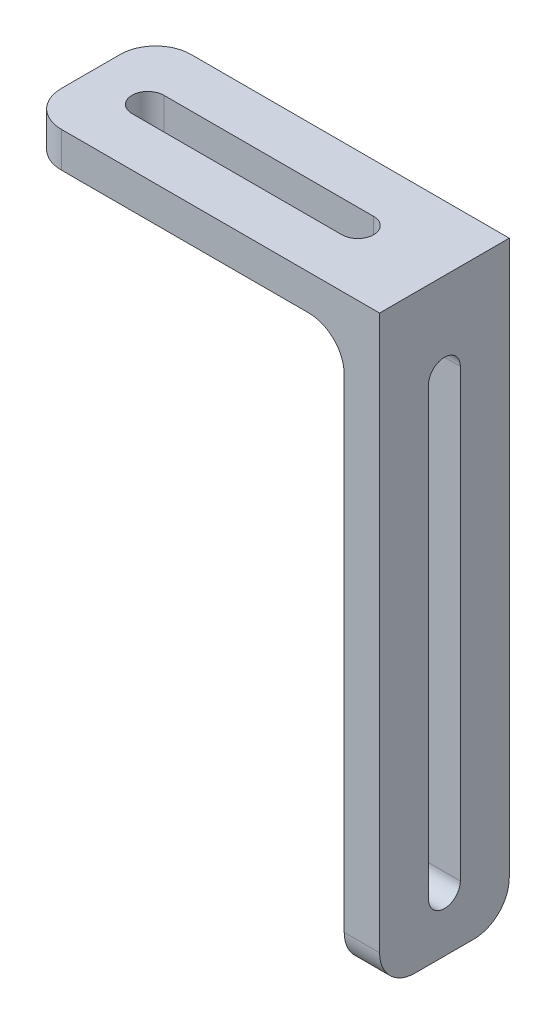
ISO-10303-21;
HEADER;
FILE_DESCRIPTION(('STEP AP214'),'2;1');
FILE_NAME('part.step','',(''),(''),'','','');
FILE_SCHEMA(('AUTOMOTIVE_DESIGN { 1 0 10303 214 1 1 1 1 }'));
ENDSEC;
DATA;
#1=APPLICATION_CONTEXT('core data for automotive mechanical design processes');
#2=APPLICATION_PROTOCOL_DEFINITION('international standard','automotive_design',2000,#1);
#3=PRODUCT_CONTEXT('',#1,'mechanical');
#4=PRODUCT('Part','Part','',(#3));
#5=PRODUCT_RELATED_PRODUCT_CATEGORY('part','',(#4));
#6=PRODUCT_DEFINITION_FORMATION('','',#4);
#7=PRODUCT_DEFINITION_CONTEXT('part definition',#1,'design');
#8=PRODUCT_DEFINITION('design','',#6,#7);
#9=PRODUCT_DEFINITION_SHAPE('','',#8);
#10=(LENGTH_UNIT() NAMED_UNIT(*) SI_UNIT(.MILLI.,.METRE.));
#11=(NAMED_UNIT(*) PLANE_ANGLE_UNIT() SI_UNIT($,.RADIAN.));
#12=(NAMED_UNIT(*) SI_UNIT($,.STERADIAN.) SOLID_ANGLE_UNIT());
#13=UNCERTAINTY_MEASURE_WITH_UNIT(LENGTH_MEASURE(1.E-05),#10,'distance_accuracy_value','');
#14=(GEOMETRIC_REPRESENTATION_CONTEXT(3) GLOBAL_UNCERTAINTY_ASSIGNED_CONTEXT((#13)) GLOBAL_UNIT_ASSIGNED_CONTEXT((#10,
#11,#12)) REPRESENTATION_CONTEXT('',''));
#15=CARTESIAN_POINT('',(0.,0.,0.));
#16=DIRECTION('',(0.,0.,1.));
#17=DIRECTION('',(1.,0.,0.));
#18=AXIS2_PLACEMENT_3D('',#15,#16,#17);
#19=CARTESIAN_POINT('',(0.,47.,11.));
#20=DIRECTION('',(1.,0.,0.));
#21=DIRECTION('',(0.,0.,-1.));
#22=AXIS2_PLACEMENT_3D('',#19,#20,#21);
#23=PLANE('',#22);
#24=DIRECTION('',(0.,-1.,0.));
#25=VECTOR('',#24,1.);
#26=CARTESIAN_POINT('',(0.,47.,0.));
#27=LINE('',#26,#25);
#28=CARTESIAN_POINT('',(0.,44.,0.));
#29=VERTEX_POINT('',#28);
#30=CARTESIAN_POINT('',(0.,3.,0.));
#31=VERTEX_POINT('',#30);
#32=EDGE_CURVE('E243',#29,#31,#27,.T.);
#33=ORIENTED_EDGE('',*,*,#32,.T.);
#34=CARTESIAN_POINT('',(0.,3.,3.));
#35=DIRECTION('',(1.,0.,0.));
#36=DIRECTION('',(0.,0.,-1.));
#37=AXIS2_PLACEMENT_3D('',#34,#35,#36);
#38=CIRCLE('',#37,3.);
#39=CARTESIAN_POINT('',(0.,0.,3.));
#40=VERTEX_POINT('',#39);
#41=EDGE_CURVE('E316',#31,#40,#38,.F.);
#42=ORIENTED_EDGE('',*,*,#41,.T.);
#43=DIRECTION('',(0.,0.,-1.));
#44=VECTOR('',#43,1.);
#45=CARTESIAN_POINT('',(0.,0.,11.));
#46=LINE('',#45,#44);
#47=CARTESIAN_POINT('',(0.,0.,8.));
#48=VERTEX_POINT('',#47);
#49=EDGE_CURVE('E273',#48,#40,#46,.T.);
#50=ORIENTED_EDGE('',*,*,#49,.F.);
#51=CARTESIAN_POINT('',(0.,3.,8.));
#52=DIRECTION('',(1.,0.,0.));
#53=DIRECTION('',(0.,0.,-1.));
#54=AXIS2_PLACEMENT_3D('',#51,#52,#53);
#55=CIRCLE('',#54,3.);
#56=CARTESIAN_POINT('',(0.,3.,11.));
#57=VERTEX_POINT('',#56);
#58=EDGE_CURVE('E314',#48,#57,#55,.F.);
#59=ORIENTED_EDGE('',*,*,#58,.T.);
#60=DIRECTION('',(0.,-1.,0.));
#61=VECTOR('',#60,1.);
#62=CARTESIAN_POINT('',(0.,47.,11.));
#63=LINE('',#62,#61);
#64=CARTESIAN_POINT('',(0.,44.,11.));
#65=VERTEX_POINT('',#64);
#66=EDGE_CURVE('E244',#65,#57,#63,.T.);
#67=ORIENTED_EDGE('',*,*,#66,.F.);
#68=DIRECTION('',(0.,0.,-1.));
#69=VECTOR('',#68,1.);
#70=CARTESIAN_POINT('',(0.,44.,0.));
#71=LINE('',#70,#69);
#72=CARTESIAN_POINT('',(0.,44.,5.5));
#73=VERTEX_POINT('',#72);
#74=EDGE_CURVE('E288',#65,#73,#71,.T.);
#75=ORIENTED_EDGE('',*,*,#74,.T.);
#76=CARTESIAN_POINT('',(0.,42.65,5.5));
#77=DIRECTION('',(1.,0.,0.));
#78=DIRECTION('',(0.,0.,-1.));
#79=AXIS2_PLACEMENT_3D('',#76,#77,#78);
#80=CIRCLE('',#79,1.35);
#81=CARTESIAN_POINT('',(0.,42.65,6.85));
#82=VERTEX_POINT('',#81);
#83=EDGE_CURVE('E239',#73,#82,#80,.T.);
#84=ORIENTED_EDGE('',*,*,#83,.T.);
#85=DIRECTION('',(0.,-1.,0.));
#86=VECTOR('',#85,1.);
#87=CARTESIAN_POINT('',(0.,47.,6.85));
#88=LINE('',#87,#86);
#89=CARTESIAN_POINT('',(0.,4.85,6.84999999999999));
#90=VERTEX_POINT('',#89);
#91=EDGE_CURVE('E224',#82,#90,#88,.T.);
#92=ORIENTED_EDGE('',*,*,#91,.T.);
#93=CARTESIAN_POINT('',(0.,4.85,5.49999999999999));
#94=DIRECTION('',(1.,0.,0.));
#95=DIRECTION('',(0.,0.,-1.));
#96=AXIS2_PLACEMENT_3D('',#93,#94,#95);
#97=CIRCLE('',#96,1.35);
#98=CARTESIAN_POINT('',(0.,4.85,4.15));
#99=VERTEX_POINT('',#98);
#100=EDGE_CURVE('E233',#90,#99,#97,.T.);
#101=ORIENTED_EDGE('',*,*,#100,.T.);
#102=DIRECTION('',(0.,1.,0.));
#103=VECTOR('',#102,1.);
#104=CARTESIAN_POINT('',(0.,47.,4.15));
#105=LINE('',#104,#103);
#106=CARTESIAN_POINT('',(0.,42.65,4.15));
#107=VERTEX_POINT('',#106);
#108=EDGE_CURVE('E236',#99,#107,#105,.T.);
#109=ORIENTED_EDGE('',*,*,#108,.T.);
#110=EDGE_CURVE('E240',#107,#73,#80,.T.);
#111=ORIENTED_EDGE('',*,*,#110,.T.);
#112=DIRECTION('',(0.,0.,-1.));
#113=VECTOR('',#112,1.);
#114=CARTESIAN_POINT('',(0.,44.,0.));
#115=LINE('',#114,#113);
#116=EDGE_CURVE('E286',#73,#29,#115,.T.);
#117=ORIENTED_EDGE('',*,*,#116,.T.);
#118=EDGE_LOOP('',(#33,#42,#50,#59,#67,#75,#84,#92,#101,#109,#111,#117));
#119=FACE_BOUND('',#118,.T.);
#120=ADVANCED_FACE('F38',(#119),#23,.F.);
#121=CARTESIAN_POINT('',(0.,0.,11.));
#122=DIRECTION('',(0.,1.,0.));
#123=DIRECTION('',(0.,0.,1.));
#124=AXIS2_PLACEMENT_3D('',#121,#122,#123);
#125=PLANE('',#124);
#126=ORIENTED_EDGE('',*,*,#49,.T.);
#127=DIRECTION('',(1.,0.,0.));
#128=VECTOR('',#127,1.);
#129=CARTESIAN_POINT('',(0.,0.,3.));
#130=LINE('',#129,#128);
#131=CARTESIAN_POINT('',(3.,0.,3.));
#132=VERTEX_POINT('',#131);
#133=EDGE_CURVE('E303',#40,#132,#130,.T.);
#134=ORIENTED_EDGE('',*,*,#133,.T.);
#135=DIRECTION('',(0.,0.,-1.));
#136=VECTOR('',#135,1.);
#137=CARTESIAN_POINT('',(3.,0.,11.));
#138=LINE('',#137,#136);
#139=CARTESIAN_POINT('',(3.,0.,8.));
#140=VERTEX_POINT('',#139);
#141=EDGE_CURVE('E270',#140,#132,#138,.T.);
#142=ORIENTED_EDGE('',*,*,#141,.F.);
#143=DIRECTION('',(1.,0.,0.));
#144=VECTOR('',#143,1.);
#145=CARTESIAN_POINT('',(0.,0.,8.));
#146=LINE('',#145,#144);
#147=EDGE_CURVE('E301',#140,#48,#146,.F.);
#148=ORIENTED_EDGE('',*,*,#147,.T.);
#149=EDGE_LOOP('',(#126,#134,#142,#148));
#150=FACE_BOUND('',#149,.T.);
#151=ADVANCED_FACE('F360',(#150),#125,.F.);
#152=CARTESIAN_POINT('',(3.,0.,11.));
#153=DIRECTION('',(-1.,0.,0.));
#154=DIRECTION('',(0.,0.,1.));
#155=AXIS2_PLACEMENT_3D('',#152,#153,#154);
#156=PLANE('',#155);
#157=DIRECTION('',(0.,-1.,0.));
#158=VECTOR('',#157,1.);
#159=CARTESIAN_POINT('',(3.,42.65,6.85));
#160=LINE('',#159,#158);
#161=CARTESIAN_POINT('',(3.,42.65,6.85));
#162=VERTEX_POINT('',#161);
#163=CARTESIAN_POINT('',(3.,4.85,6.84999999999999));
#164=VERTEX_POINT('',#163);
#165=EDGE_CURVE('E212',#162,#164,#160,.T.);
#166=ORIENTED_EDGE('',*,*,#165,.F.);
#167=CARTESIAN_POINT('',(3.,42.65,5.5));
#168=DIRECTION('',(1.,0.,0.));
#169=DIRECTION('',(0.,0.,-1.));
#170=AXIS2_PLACEMENT_3D('',#167,#168,#169);
#171=CIRCLE('',#170,1.35);
#172=CARTESIAN_POINT('',(3.,42.65,4.15));
#173=VERTEX_POINT('',#172);
#174=EDGE_CURVE('E208',#173,#162,#171,.T.);
#175=ORIENTED_EDGE('',*,*,#174,.F.);
#176=DIRECTION('',(0.,1.,0.));
#177=VECTOR('',#176,1.);
#178=CARTESIAN_POINT('',(3.,42.65,4.15));
#179=LINE('',#178,#177);
#180=CARTESIAN_POINT('',(3.,4.85,4.15));
#181=VERTEX_POINT('',#180);
#182=EDGE_CURVE('E218',#181,#173,#179,.T.);
#183=ORIENTED_EDGE('',*,*,#182,.F.);
#184=CARTESIAN_POINT('',(3.,4.85,5.49999999999999));
#185=DIRECTION('',(1.,0.,0.));
#186=DIRECTION('',(0.,0.,-1.));
#187=AXIS2_PLACEMENT_3D('',#184,#185,#186);
#188=CIRCLE('',#187,1.35);
#189=EDGE_CURVE('E215',#164,#181,#188,.T.);
#190=ORIENTED_EDGE('',*,*,#189,.F.);
#191=EDGE_LOOP('',(#166,#175,#183,#190));
#192=FACE_BOUND('',#191,.T.);
#193=ORIENTED_EDGE('',*,*,#141,.T.);
#194=CARTESIAN_POINT('',(3.,3.,3.));
#195=DIRECTION('',(-1.,0.,0.));
#196=DIRECTION('',(0.,0.,1.));
#197=AXIS2_PLACEMENT_3D('',#194,#195,#196);
#198=CIRCLE('',#197,3.);
#199=CARTESIAN_POINT('',(3.,3.,0.));
#200=VERTEX_POINT('',#199);
#201=EDGE_CURVE('E308',#132,#200,#198,.F.);
#202=ORIENTED_EDGE('',*,*,#201,.T.);
#203=DIRECTION('',(0.,1.,0.));
#204=VECTOR('',#203,1.);
#205=CARTESIAN_POINT('',(3.,0.,0.));
#206=LINE('',#205,#204);
#207=CARTESIAN_POINT('',(3.,50.,0.));
#208=VERTEX_POINT('',#207);
#209=EDGE_CURVE('E258',#200,#208,#206,.T.);
#210=ORIENTED_EDGE('',*,*,#209,.T.);
#211=DIRECTION('',(0.,0.,-1.));
#212=VECTOR('',#211,1.);
#213=CARTESIAN_POINT('',(3.,50.,11.));
#214=LINE('',#213,#212);
#215=CARTESIAN_POINT('',(3.,50.,11.));
#216=VERTEX_POINT('',#215);
#217=EDGE_CURVE('E267',#216,#208,#214,.T.);
#218=ORIENTED_EDGE('',*,*,#217,.F.);
#219=DIRECTION('',(0.,1.,0.));
#220=VECTOR('',#219,1.);
#221=CARTESIAN_POINT('',(3.,0.,11.));
#222=LINE('',#221,#220);
#223=CARTESIAN_POINT('',(3.,3.,11.));
#224=VERTEX_POINT('',#223);
#225=EDGE_CURVE('E247',#224,#216,#222,.T.);
#226=ORIENTED_EDGE('',*,*,#225,.F.);
#227=CARTESIAN_POINT('',(3.,3.,8.));
#228=DIRECTION('',(-1.,0.,0.));
#229=DIRECTION('',(0.,0.,1.));
#230=AXIS2_PLACEMENT_3D('',#227,#228,#229);
#231=CIRCLE('',#230,3.);
#232=EDGE_CURVE('E306',#224,#140,#231,.F.);
#233=ORIENTED_EDGE('',*,*,#232,.T.);
#234=EDGE_LOOP('',(#193,#202,#210,#218,#226,#233));
#235=FACE_BOUND('',#234,.T.);
#236=ADVANCED_FACE('F366',(#192,#235),#156,.F.);
#237=CARTESIAN_POINT('',(3.,50.,11.));
#238=DIRECTION('',(0.,-1.,0.));
#239=DIRECTION('',(0.,0.,-1.));
#240=AXIS2_PLACEMENT_3D('',#237,#238,#239);
#241=PLANE('',#240);
#242=DIRECTION('',(1.,0.,0.));
#243=VECTOR('',#242,1.);
#244=CARTESIAN_POINT('',(-22.15,50.,6.85));
#245=LINE('',#244,#243);
#246=CARTESIAN_POINT('',(-22.15,50.,6.85));
#247=VERTEX_POINT('',#246);
#248=CARTESIAN_POINT('',(-4.35,50.,6.85));
#249=VERTEX_POINT('',#248);
#250=EDGE_CURVE('E192',#247,#249,#245,.T.);
#251=ORIENTED_EDGE('',*,*,#250,.F.);
#252=CARTESIAN_POINT('',(-22.15,50.,5.5));
#253=DIRECTION('',(0.,1.,0.));
#254=DIRECTION('',(0.,0.,1.));
#255=AXIS2_PLACEMENT_3D('',#252,#253,#254);
#256=CIRCLE('',#255,1.35);
#257=CARTESIAN_POINT('',(-22.15,50.,4.15));
#258=VERTEX_POINT('',#257);
#259=EDGE_CURVE('E197',#258,#247,#256,.T.);
#260=ORIENTED_EDGE('',*,*,#259,.F.);
#261=DIRECTION('',(1.,0.,0.));
#262=VECTOR('',#261,1.);
#263=CARTESIAN_POINT('',(-22.15,50.,4.15));
#264=LINE('',#263,#262);
#265=CARTESIAN_POINT('',(-4.35,50.,4.15));
#266=VERTEX_POINT('',#265);
#267=EDGE_CURVE('E201',#258,#266,#264,.T.);
#268=ORIENTED_EDGE('',*,*,#267,.T.);
#269=CARTESIAN_POINT('',(-4.35,50.,5.5));
#270=DIRECTION('',(0.,1.,0.));
#271=DIRECTION('',(0.,0.,1.));
#272=AXIS2_PLACEMENT_3D('',#269,#270,#271);
#273=CIRCLE('',#272,1.35);
#274=EDGE_CURVE('E180',#249,#266,#273,.T.);
#275=ORIENTED_EDGE('',*,*,#274,.F.);
#276=EDGE_LOOP('',(#251,#260,#268,#275));
#277=FACE_BOUND('',#276,.T.);
#278=DIRECTION('',(0.,0.,-1.));
#279=VECTOR('',#278,1.);
#280=CARTESIAN_POINT('',(-27.,50.,11.));
#281=LINE('',#280,#279);
#282=CARTESIAN_POINT('',(-27.,50.,8.));
#283=VERTEX_POINT('',#282);
#284=CARTESIAN_POINT('',(-27.,50.,3.));
#285=VERTEX_POINT('',#284);
#286=EDGE_CURVE('E265',#283,#285,#281,.T.);
#287=ORIENTED_EDGE('',*,*,#286,.F.);
#288=CARTESIAN_POINT('',(-24.,50.,8.));
#289=DIRECTION('',(0.,-1.,0.));
#290=DIRECTION('',(0.,0.,-1.));
#291=AXIS2_PLACEMENT_3D('',#288,#289,#290);
#292=CIRCLE('',#291,3.);
#293=CARTESIAN_POINT('',(-24.,50.,11.));
#294=VERTEX_POINT('',#293);
#295=EDGE_CURVE('E11',#283,#294,#292,.F.);
#296=ORIENTED_EDGE('',*,*,#295,.T.);
#297=DIRECTION('',(-1.,0.,0.));
#298=VECTOR('',#297,1.);
#299=CARTESIAN_POINT('',(3.,50.,11.));
#300=LINE('',#299,#298);
#301=EDGE_CURVE('E250',#216,#294,#300,.T.);
#302=ORIENTED_EDGE('',*,*,#301,.F.);
#303=ORIENTED_EDGE('',*,*,#217,.T.);
#304=DIRECTION('',(-1.,0.,0.));
#305=VECTOR('',#304,1.);
#306=CARTESIAN_POINT('',(3.,50.,0.));
#307=LINE('',#306,#305);
#308=CARTESIAN_POINT('',(-24.,50.,0.));
#309=VERTEX_POINT('',#308);
#310=EDGE_CURVE('E260',#208,#309,#307,.T.);
#311=ORIENTED_EDGE('',*,*,#310,.T.);
#312=CARTESIAN_POINT('',(-24.,50.,3.));
#313=DIRECTION('',(0.,-1.,0.));
#314=DIRECTION('',(0.,0.,-1.));
#315=AXIS2_PLACEMENT_3D('',#312,#313,#314);
#316=CIRCLE('',#315,3.);
#317=EDGE_CURVE('E46',#309,#285,#316,.F.);
#318=ORIENTED_EDGE('',*,*,#317,.T.);
#319=EDGE_LOOP('',(#287,#296,#302,#303,#311,#318));
#320=FACE_BOUND('',#319,.T.);
#321=ADVANCED_FACE('F199',(#277,#320),#241,.F.);
#322=CARTESIAN_POINT('',(-27.,50.,11.));
#323=DIRECTION('',(1.,0.,0.));
#324=DIRECTION('',(0.,0.,-1.));
#325=AXIS2_PLACEMENT_3D('',#322,#323,#324);
#326=PLANE('',#325);
#327=DIRECTION('',(0.,0.,-1.));
#328=VECTOR('',#327,1.);
#329=CARTESIAN_POINT('',(-27.,47.,11.));
#330=LINE('',#329,#328);
#331=CARTESIAN_POINT('',(-27.,47.,8.));
#332=VERTEX_POINT('',#331);
#333=CARTESIAN_POINT('',(-27.,47.,3.));
#334=VERTEX_POINT('',#333);
#335=EDGE_CURVE('E255',#332,#334,#330,.T.);
#336=ORIENTED_EDGE('',*,*,#335,.F.);
#337=DIRECTION('',(0.,-1.,0.));
#338=VECTOR('',#337,1.);
#339=CARTESIAN_POINT('',(-27.,50.,8.));
#340=LINE('',#339,#338);
#341=EDGE_CURVE('E59',#332,#283,#340,.F.);
#342=ORIENTED_EDGE('',*,*,#341,.T.);
#343=ORIENTED_EDGE('',*,*,#286,.T.);
#344=DIRECTION('',(0.,-1.,0.));
#345=VECTOR('',#344,1.);
#346=CARTESIAN_POINT('',(-27.,50.,3.));
#347=LINE('',#346,#345);
#348=EDGE_CURVE('E328',#285,#334,#347,.T.);
#349=ORIENTED_EDGE('',*,*,#348,.T.);
#350=EDGE_LOOP('',(#336,#342,#343,#349));
#351=FACE_BOUND('',#350,.T.);
#352=ADVANCED_FACE('F332',(#351),#326,.F.);
#353=CARTESIAN_POINT('',(-27.,47.,11.));
#354=DIRECTION('',(0.,1.,0.));
#355=DIRECTION('',(0.,0.,1.));
#356=AXIS2_PLACEMENT_3D('',#353,#354,#355);
#357=PLANE('',#356);
#358=DIRECTION('',(1.,0.,0.));
#359=VECTOR('',#358,1.);
#360=CARTESIAN_POINT('',(-27.,47.,11.));
#361=LINE('',#360,#359);
#362=CARTESIAN_POINT('',(-24.,47.,11.));
#363=VERTEX_POINT('',#362);
#364=CARTESIAN_POINT('',(-3.,47.,11.));
#365=VERTEX_POINT('',#364);
#366=EDGE_CURVE('E253',#363,#365,#361,.T.);
#367=ORIENTED_EDGE('',*,*,#366,.F.);
#368=CARTESIAN_POINT('',(-24.,47.,8.));
#369=DIRECTION('',(0.,1.,0.));
#370=DIRECTION('',(0.,0.,1.));
#371=AXIS2_PLACEMENT_3D('',#368,#369,#370);
#372=CIRCLE('',#371,3.);
#373=EDGE_CURVE('E326',#363,#332,#372,.F.);
#374=ORIENTED_EDGE('',*,*,#373,.T.);
#375=ORIENTED_EDGE('',*,*,#335,.T.);
#376=CARTESIAN_POINT('',(-24.,47.,3.));
#377=DIRECTION('',(0.,1.,0.));
#378=DIRECTION('',(0.,0.,1.));
#379=AXIS2_PLACEMENT_3D('',#376,#377,#378);
#380=CIRCLE('',#379,3.);
#381=CARTESIAN_POINT('',(-24.,47.,0.));
#382=VERTEX_POINT('',#381);
#383=EDGE_CURVE('E324',#334,#382,#380,.F.);
#384=ORIENTED_EDGE('',*,*,#383,.T.);
#385=DIRECTION('',(1.,0.,0.));
#386=VECTOR('',#385,1.);
#387=CARTESIAN_POINT('',(-27.,47.,0.));
#388=LINE('',#387,#386);
#389=CARTESIAN_POINT('',(-3.,47.,0.));
#390=VERTEX_POINT('',#389);
#391=EDGE_CURVE('E248',#382,#390,#388,.T.);
#392=ORIENTED_EDGE('',*,*,#391,.T.);
#393=DIRECTION('',(0.,0.,-1.));
#394=VECTOR('',#393,1.);
#395=CARTESIAN_POINT('',(-3.,47.,11.));
#396=LINE('',#395,#394);
#397=CARTESIAN_POINT('',(-3.,47.,5.5));
#398=VERTEX_POINT('',#397);
#399=EDGE_CURVE('E294',#390,#398,#396,.F.);
#400=ORIENTED_EDGE('',*,*,#399,.T.);
#401=CARTESIAN_POINT('',(-4.35,47.,5.5));
#402=DIRECTION('',(0.,1.,0.));
#403=DIRECTION('',(0.,0.,1.));
#404=AXIS2_PLACEMENT_3D('',#401,#402,#403);
#405=CIRCLE('',#404,1.35);
#406=CARTESIAN_POINT('',(-4.35,47.,4.15));
#407=VERTEX_POINT('',#406);
#408=EDGE_CURVE('E278',#398,#407,#405,.T.);
#409=ORIENTED_EDGE('',*,*,#408,.T.);
#410=DIRECTION('',(1.,0.,0.));
#411=VECTOR('',#410,1.);
#412=CARTESIAN_POINT('',(-27.,47.,4.15));
#413=LINE('',#412,#411);
#414=CARTESIAN_POINT('',(-22.15,47.,4.15));
#415=VERTEX_POINT('',#414);
#416=EDGE_CURVE('E280',#415,#407,#413,.T.);
#417=ORIENTED_EDGE('',*,*,#416,.F.);
#418=CARTESIAN_POINT('',(-22.15,47.,5.5));
#419=DIRECTION('',(0.,1.,0.));
#420=DIRECTION('',(0.,0.,1.));
#421=AXIS2_PLACEMENT_3D('',#418,#419,#420);
#422=CIRCLE('',#421,1.35);
#423=CARTESIAN_POINT('',(-22.15,47.,6.85));
#424=VERTEX_POINT('',#423);
#425=EDGE_CURVE('E283',#415,#424,#422,.T.);
#426=ORIENTED_EDGE('',*,*,#425,.T.);
#427=DIRECTION('',(1.,0.,0.));
#428=VECTOR('',#427,1.);
#429=CARTESIAN_POINT('',(-27.,47.,6.85));
#430=LINE('',#429,#428);
#431=CARTESIAN_POINT('',(-4.35,47.,6.85));
#432=VERTEX_POINT('',#431);
#433=EDGE_CURVE('E276',#424,#432,#430,.T.);
#434=ORIENTED_EDGE('',*,*,#433,.T.);
#435=EDGE_CURVE('E184',#432,#398,#405,.T.);
#436=ORIENTED_EDGE('',*,*,#435,.T.);
#437=DIRECTION('',(0.,0.,-1.));
#438=VECTOR('',#437,1.);
#439=CARTESIAN_POINT('',(-3.,47.,11.));
#440=LINE('',#439,#438);
#441=EDGE_CURVE('E291',#398,#365,#440,.F.);
#442=ORIENTED_EDGE('',*,*,#441,.T.);
#443=EDGE_LOOP('',(#367,#374,#375,#384,#392,#400,#409,#417,#426,#434,#436,#442));
#444=FACE_BOUND('',#443,.T.);
#445=ADVANCED_FACE('F336',(#444),#357,.F.);
#446=CARTESIAN_POINT('',(0.,0.,11.));
#447=DIRECTION('',(0.,0.,1.));
#448=DIRECTION('',(1.,0.,0.));
#449=AXIS2_PLACEMENT_3D('',#446,#447,#448);
#450=PLANE('',#449);
#451=ORIENTED_EDGE('',*,*,#66,.T.);
#452=DIRECTION('',(1.,0.,0.));
#453=VECTOR('',#452,1.);
#454=CARTESIAN_POINT('',(3.,3.,11.));
#455=LINE('',#454,#453);
#456=EDGE_CURVE('E321',#57,#224,#455,.T.);
#457=ORIENTED_EDGE('',*,*,#456,.T.);
#458=ORIENTED_EDGE('',*,*,#225,.T.);
#459=ORIENTED_EDGE('',*,*,#301,.T.);
#460=DIRECTION('',(0.,-1.,0.));
#461=VECTOR('',#460,1.);
#462=CARTESIAN_POINT('',(-24.,47.,11.));
#463=LINE('',#462,#461);
#464=EDGE_CURVE('E318',#294,#363,#463,.T.);
#465=ORIENTED_EDGE('',*,*,#464,.T.);
#466=ORIENTED_EDGE('',*,*,#366,.T.);
#467=CARTESIAN_POINT('',(-3.,44.,11.));
#468=DIRECTION('',(0.,0.,1.));
#469=DIRECTION('',(1.,0.,0.));
#470=AXIS2_PLACEMENT_3D('',#467,#468,#469);
#471=CIRCLE('',#470,3.);
#472=EDGE_CURVE('E299',#365,#65,#471,.F.);
#473=ORIENTED_EDGE('',*,*,#472,.T.);
#474=EDGE_LOOP('',(#451,#457,#458,#459,#465,#466,#473));
#475=FACE_BOUND('',#474,.T.);
#476=ADVANCED_FACE('F343',(#475),#450,.T.);
#477=CARTESIAN_POINT('',(0.,0.,0.));
#478=DIRECTION('',(0.,0.,1.));
#479=DIRECTION('',(1.,0.,0.));
#480=AXIS2_PLACEMENT_3D('',#477,#478,#479);
#481=PLANE('',#480);
#482=ORIENTED_EDGE('',*,*,#209,.F.);
#483=DIRECTION('',(1.,0.,0.));
#484=VECTOR('',#483,1.);
#485=CARTESIAN_POINT('',(0.,3.,0.));
#486=LINE('',#485,#484);
#487=EDGE_CURVE('E312',#200,#31,#486,.F.);
#488=ORIENTED_EDGE('',*,*,#487,.T.);
#489=ORIENTED_EDGE('',*,*,#32,.F.);
#490=CARTESIAN_POINT('',(-3.,44.,0.));
#491=DIRECTION('',(0.,0.,1.));
#492=DIRECTION('',(1.,0.,0.));
#493=AXIS2_PLACEMENT_3D('',#490,#491,#492);
#494=CIRCLE('',#493,3.);
#495=EDGE_CURVE('E296',#29,#390,#494,.T.);
#496=ORIENTED_EDGE('',*,*,#495,.T.);
#497=ORIENTED_EDGE('',*,*,#391,.F.);
#498=DIRECTION('',(0.,-1.,0.));
#499=VECTOR('',#498,1.);
#500=CARTESIAN_POINT('',(-24.,0.,0.));
#501=LINE('',#500,#499);
#502=EDGE_CURVE('E310',#382,#309,#501,.F.);
#503=ORIENTED_EDGE('',*,*,#502,.T.);
#504=ORIENTED_EDGE('',*,*,#310,.F.);
#505=EDGE_LOOP('',(#482,#488,#489,#496,#497,#503,#504));
#506=FACE_BOUND('',#505,.T.);
#507=ADVANCED_FACE('F351',(#506),#481,.F.);
#508=CARTESIAN_POINT('',(-27.,42.65,5.5));
#509=DIRECTION('',(1.,0.,0.));
#510=DIRECTION('',(0.,0.,-1.));
#511=AXIS2_PLACEMENT_3D('',#508,#509,#510);
#512=CYLINDRICAL_SURFACE('',#511,1.35);
#513=DIRECTION('',(1.,0.,0.));
#514=VECTOR('',#513,1.);
#515=CARTESIAN_POINT('',(-27.,42.65,4.15));
#516=LINE('',#515,#514);
#517=EDGE_CURVE('E222',#107,#173,#516,.T.);
#518=ORIENTED_EDGE('',*,*,#517,.T.);
#519=ORIENTED_EDGE('',*,*,#174,.T.);
#520=DIRECTION('',(1.,0.,0.));
#521=VECTOR('',#520,1.);
#522=CARTESIAN_POINT('',(-27.,42.65,6.85));
#523=LINE('',#522,#521);
#524=EDGE_CURVE('E221',#82,#162,#523,.T.);
#525=ORIENTED_EDGE('',*,*,#524,.F.);
#526=ORIENTED_EDGE('',*,*,#83,.F.);
#527=ORIENTED_EDGE('',*,*,#110,.F.);
#528=EDGE_LOOP('',(#518,#519,#525,#526,#527));
#529=FACE_BOUND('',#528,.T.);
#530=ADVANCED_FACE('F397',(#529),#512,.F.);
#531=CARTESIAN_POINT('',(-27.,42.65,4.15));
#532=DIRECTION('',(0.,0.,-1.));
#533=DIRECTION('',(0.,1.,0.));
#534=AXIS2_PLACEMENT_3D('',#531,#532,#533);
#535=PLANE('',#534);
#536=DIRECTION('',(1.,0.,0.));
#537=VECTOR('',#536,1.);
#538=CARTESIAN_POINT('',(-27.,4.85,4.15));
#539=LINE('',#538,#537);
#540=EDGE_CURVE('E225',#99,#181,#539,.T.);
#541=ORIENTED_EDGE('',*,*,#540,.T.);
#542=ORIENTED_EDGE('',*,*,#182,.T.);
#543=ORIENTED_EDGE('',*,*,#517,.F.);
#544=ORIENTED_EDGE('',*,*,#108,.F.);
#545=EDGE_LOOP('',(#541,#542,#543,#544));
#546=FACE_BOUND('',#545,.T.);
#547=ADVANCED_FACE('F403',(#546),#535,.F.);
#548=CARTESIAN_POINT('',(-27.,4.85,5.49999999999999));
#549=DIRECTION('',(1.,0.,0.));
#550=DIRECTION('',(0.,0.,-1.));
#551=AXIS2_PLACEMENT_3D('',#548,#549,#550);
#552=CYLINDRICAL_SURFACE('',#551,1.35);
#553=DIRECTION('',(1.,0.,0.));
#554=VECTOR('',#553,1.);
#555=CARTESIAN_POINT('',(-27.,4.85,6.84999999999999));
#556=LINE('',#555,#554);
#557=EDGE_CURVE('E227',#90,#164,#556,.T.);
#558=ORIENTED_EDGE('',*,*,#557,.T.);
#559=ORIENTED_EDGE('',*,*,#189,.T.);
#560=ORIENTED_EDGE('',*,*,#540,.F.);
#561=ORIENTED_EDGE('',*,*,#100,.F.);
#562=EDGE_LOOP('',(#558,#559,#560,#561));
#563=FACE_BOUND('',#562,.T.);
#564=ADVANCED_FACE('F405',(#563),#552,.F.);
#565=CARTESIAN_POINT('',(-27.,42.65,6.85));
#566=DIRECTION('',(0.,0.,1.));
#567=DIRECTION('',(0.,-1.,0.));
#568=AXIS2_PLACEMENT_3D('',#565,#566,#567);
#569=PLANE('',#568);
#570=ORIENTED_EDGE('',*,*,#524,.T.);
#571=ORIENTED_EDGE('',*,*,#165,.T.);
#572=ORIENTED_EDGE('',*,*,#557,.F.);
#573=ORIENTED_EDGE('',*,*,#91,.F.);
#574=EDGE_LOOP('',(#570,#571,#572,#573));
#575=FACE_BOUND('',#574,.T.);
#576=ADVANCED_FACE('F412',(#575),#569,.F.);
#577=CARTESIAN_POINT('',(-22.15,0.,5.5));
#578=DIRECTION('',(0.,1.,0.));
#579=DIRECTION('',(0.,0.,1.));
#580=AXIS2_PLACEMENT_3D('',#577,#578,#579);
#581=CYLINDRICAL_SURFACE('',#580,1.35);
#582=DIRECTION('',(0.,1.,0.));
#583=VECTOR('',#582,1.);
#584=CARTESIAN_POINT('',(-22.15,0.,4.15));
#585=LINE('',#584,#583);
#586=EDGE_CURVE('E206',#415,#258,#585,.T.);
#587=ORIENTED_EDGE('',*,*,#586,.T.);
#588=ORIENTED_EDGE('',*,*,#259,.T.);
#589=DIRECTION('',(0.,1.,0.));
#590=VECTOR('',#589,1.);
#591=CARTESIAN_POINT('',(-22.15,0.,6.85));
#592=LINE('',#591,#590);
#593=EDGE_CURVE('E188',#424,#247,#592,.T.);
#594=ORIENTED_EDGE('',*,*,#593,.F.);
#595=ORIENTED_EDGE('',*,*,#425,.F.);
#596=EDGE_LOOP('',(#587,#588,#594,#595));
#597=FACE_BOUND('',#596,.T.);
#598=ADVANCED_FACE('F414',(#597),#581,.F.);
#599=CARTESIAN_POINT('',(-22.15,0.,4.15));
#600=DIRECTION('',(0.,0.,1.));
#601=DIRECTION('',(1.,0.,0.));
#602=AXIS2_PLACEMENT_3D('',#599,#600,#601);
#603=PLANE('',#602);
#604=ORIENTED_EDGE('',*,*,#416,.T.);
#605=DIRECTION('',(0.,1.,0.));
#606=VECTOR('',#605,1.);
#607=CARTESIAN_POINT('',(-4.35,0.,4.15));
#608=LINE('',#607,#606);
#609=EDGE_CURVE('E187',#407,#266,#608,.T.);
#610=ORIENTED_EDGE('',*,*,#609,.T.);
#611=ORIENTED_EDGE('',*,*,#267,.F.);
#612=ORIENTED_EDGE('',*,*,#586,.F.);
#613=EDGE_LOOP('',(#604,#610,#611,#612));
#614=FACE_BOUND('',#613,.T.);
#615=ADVANCED_FACE('F420',(#614),#603,.T.);
#616=CARTESIAN_POINT('',(-4.35,0.,5.5));
#617=DIRECTION('',(0.,1.,0.));
#618=DIRECTION('',(0.,0.,1.));
#619=AXIS2_PLACEMENT_3D('',#616,#617,#618);
#620=CYLINDRICAL_SURFACE('',#619,1.35);
#621=DIRECTION('',(0.,1.,0.));
#622=VECTOR('',#621,1.);
#623=CARTESIAN_POINT('',(-4.35,0.,6.85));
#624=LINE('',#623,#622);
#625=EDGE_CURVE('E175',#432,#249,#624,.T.);
#626=ORIENTED_EDGE('',*,*,#625,.T.);
#627=ORIENTED_EDGE('',*,*,#274,.T.);
#628=ORIENTED_EDGE('',*,*,#609,.F.);
#629=ORIENTED_EDGE('',*,*,#408,.F.);
#630=ORIENTED_EDGE('',*,*,#435,.F.);
#631=EDGE_LOOP('',(#626,#627,#628,#629,#630));
#632=FACE_BOUND('',#631,.T.);
#633=ADVANCED_FACE('F177',(#632),#620,.F.);
#634=CARTESIAN_POINT('',(-22.15,0.,6.85));
#635=DIRECTION('',(0.,0.,1.));
#636=DIRECTION('',(1.,0.,0.));
#637=AXIS2_PLACEMENT_3D('',#634,#635,#636);
#638=PLANE('',#637);
#639=ORIENTED_EDGE('',*,*,#593,.T.);
#640=ORIENTED_EDGE('',*,*,#250,.T.);
#641=ORIENTED_EDGE('',*,*,#625,.F.);
#642=ORIENTED_EDGE('',*,*,#433,.F.);
#643=EDGE_LOOP('',(#639,#640,#641,#642));
#644=FACE_BOUND('',#643,.T.);
#645=ADVANCED_FACE('F193',(#644),#638,.F.);
#646=CARTESIAN_POINT('',(-3.,44.,11.));
#647=DIRECTION('',(0.,0.,1.));
#648=DIRECTION('',(1.,0.,0.));
#649=AXIS2_PLACEMENT_3D('',#646,#647,#648);
#650=CYLINDRICAL_SURFACE('',#649,3.);
#651=ORIENTED_EDGE('',*,*,#441,.F.);
#652=ORIENTED_EDGE('',*,*,#399,.F.);
#653=ORIENTED_EDGE('',*,*,#495,.F.);
#654=ORIENTED_EDGE('',*,*,#116,.F.);
#655=ORIENTED_EDGE('',*,*,#74,.F.);
#656=ORIENTED_EDGE('',*,*,#472,.F.);
#657=EDGE_LOOP('',(#651,#652,#653,#654,#655,#656));
#658=FACE_BOUND('',#657,.T.);
#659=ADVANCED_FACE('F371',(#658),#650,.F.);
#660=CARTESIAN_POINT('',(0.,3.,3.));
#661=DIRECTION('',(1.,0.,0.));
#662=DIRECTION('',(0.,0.,-1.));
#663=AXIS2_PLACEMENT_3D('',#660,#661,#662);
#664=CYLINDRICAL_SURFACE('',#663,3.);
#665=ORIENTED_EDGE('',*,*,#41,.F.);
#666=ORIENTED_EDGE('',*,*,#487,.F.);
#667=ORIENTED_EDGE('',*,*,#201,.F.);
#668=ORIENTED_EDGE('',*,*,#133,.F.);
#669=EDGE_LOOP('',(#665,#666,#667,#668));
#670=FACE_BOUND('',#669,.T.);
#671=ADVANCED_FACE('F374',(#670),#664,.T.);
#672=CARTESIAN_POINT('',(0.,3.,8.));
#673=DIRECTION('',(-1.,0.,0.));
#674=DIRECTION('',(0.,0.,1.));
#675=AXIS2_PLACEMENT_3D('',#672,#673,#674);
#676=CYLINDRICAL_SURFACE('',#675,3.);
#677=ORIENTED_EDGE('',*,*,#58,.F.);
#678=ORIENTED_EDGE('',*,*,#147,.F.);
#679=ORIENTED_EDGE('',*,*,#232,.F.);
#680=ORIENTED_EDGE('',*,*,#456,.F.);
#681=EDGE_LOOP('',(#677,#678,#679,#680));
#682=FACE_BOUND('',#681,.T.);
#683=ADVANCED_FACE('F358',(#682),#676,.T.);
#684=CARTESIAN_POINT('',(-24.,0.,8.));
#685=DIRECTION('',(0.,1.,0.));
#686=DIRECTION('',(0.,0.,1.));
#687=AXIS2_PLACEMENT_3D('',#684,#685,#686);
#688=CYLINDRICAL_SURFACE('',#687,3.);
#689=ORIENTED_EDGE('',*,*,#295,.F.);
#690=ORIENTED_EDGE('',*,*,#341,.F.);
#691=ORIENTED_EDGE('',*,*,#373,.F.);
#692=ORIENTED_EDGE('',*,*,#464,.F.);
#693=EDGE_LOOP('',(#689,#690,#691,#692));
#694=FACE_BOUND('',#693,.T.);
#695=ADVANCED_FACE('F341',(#694),#688,.T.);
#696=CARTESIAN_POINT('',(-24.,50.,3.));
#697=DIRECTION('',(0.,-1.,0.));
#698=DIRECTION('',(0.,0.,-1.));
#699=AXIS2_PLACEMENT_3D('',#696,#697,#698);
#700=CYLINDRICAL_SURFACE('',#699,3.);
#701=ORIENTED_EDGE('',*,*,#317,.F.);
#702=ORIENTED_EDGE('',*,*,#502,.F.);
#703=ORIENTED_EDGE('',*,*,#383,.F.);
#704=ORIENTED_EDGE('',*,*,#348,.F.);
#705=EDGE_LOOP('',(#701,#702,#703,#704));
#706=FACE_BOUND('',#705,.T.);
#707=ADVANCED_FACE('F40',(#706),#700,.T.);
#708=CLOSED_SHELL('',(#120,#151,#236,#321,#352,#445,#476,#507,#530,#547,#564,#576,#598,#615,
#633,#645,#659,#671,#683,#695,#707));
#709=MANIFOLD_SOLID_BREP('B2',#708);
#710=ADVANCED_BREP_SHAPE_REPRESENTATION('',(#18,#709),#14);
#711=SHAPE_DEFINITION_REPRESENTATION(#9,#710);
ENDSEC;
END-ISO-10303-21;
